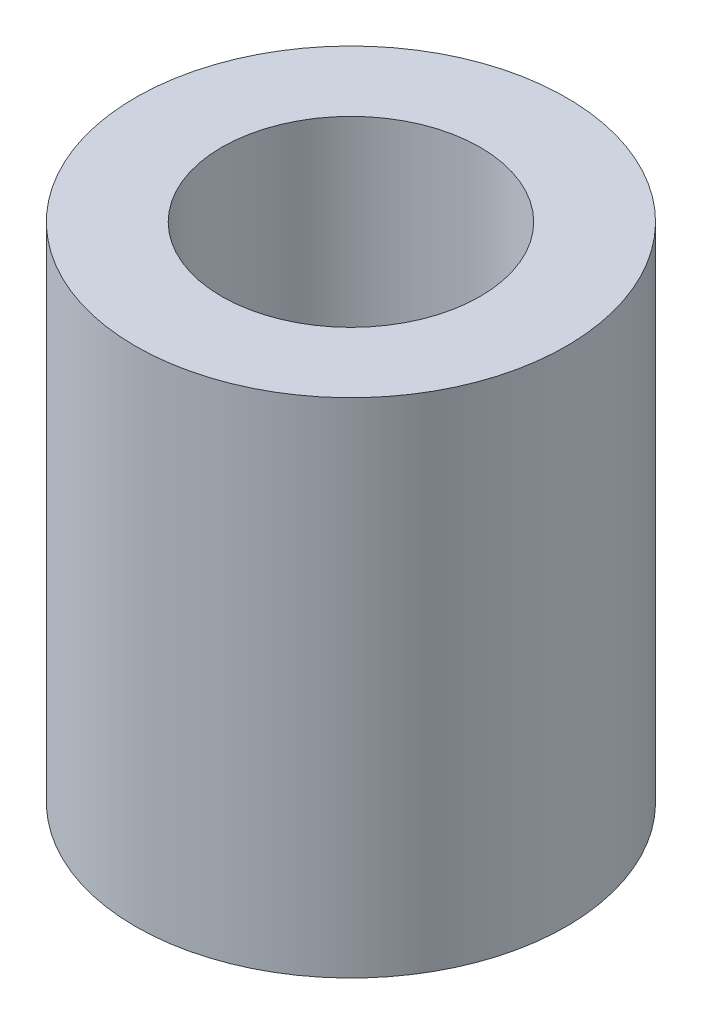
ISO-10303-21;
HEADER;
FILE_DESCRIPTION(('STEP AP214'),'2;1');
FILE_NAME('part.step','',(''),(''),'','','');
FILE_SCHEMA(('AUTOMOTIVE_DESIGN { 1 0 10303 214 1 1 1 1 }'));
ENDSEC;
DATA;
#1=APPLICATION_CONTEXT('core data for automotive mechanical design processes');
#2=APPLICATION_PROTOCOL_DEFINITION('international standard','automotive_design',2000,#1);
#3=PRODUCT_CONTEXT('',#1,'mechanical');
#4=PRODUCT('Part','Part','',(#3));
#5=PRODUCT_RELATED_PRODUCT_CATEGORY('part','',(#4));
#6=PRODUCT_DEFINITION_FORMATION('','',#4);
#7=PRODUCT_DEFINITION_CONTEXT('part definition',#1,'design');
#8=PRODUCT_DEFINITION('design','',#6,#7);
#9=PRODUCT_DEFINITION_SHAPE('','',#8);
#10=(LENGTH_UNIT() NAMED_UNIT(*) SI_UNIT(.MILLI.,.METRE.));
#11=(NAMED_UNIT(*) PLANE_ANGLE_UNIT() SI_UNIT($,.RADIAN.));
#12=(NAMED_UNIT(*) SI_UNIT($,.STERADIAN.) SOLID_ANGLE_UNIT());
#13=UNCERTAINTY_MEASURE_WITH_UNIT(LENGTH_MEASURE(1.E-05),#10,'distance_accuracy_value','');
#14=(GEOMETRIC_REPRESENTATION_CONTEXT(3) GLOBAL_UNCERTAINTY_ASSIGNED_CONTEXT((#13)) GLOBAL_UNIT_ASSIGNED_CONTEXT((#10,
#11,#12)) REPRESENTATION_CONTEXT('',''));
#15=CARTESIAN_POINT('',(0.,0.,0.));
#16=DIRECTION('',(0.,0.,1.));
#17=DIRECTION('',(1.,0.,0.));
#18=AXIS2_PLACEMENT_3D('',#15,#16,#17);
#19=CARTESIAN_POINT('',(0.,7.,0.));
#20=DIRECTION('',(0.,1.,0.));
#21=DIRECTION('',(0.,0.,1.));
#22=AXIS2_PLACEMENT_3D('',#19,#20,#21);
#23=PLANE('',#22);
#24=CARTESIAN_POINT('',(0.,7.,0.));
#25=DIRECTION('',(0.,1.,0.));
#26=DIRECTION('',(0.,0.,1.));
#27=AXIS2_PLACEMENT_3D('',#24,#25,#26);
#28=CIRCLE('',#27,3.);
#29=CARTESIAN_POINT('',(0.,7.,3.));
#30=VERTEX_POINT('',#29);
#31=EDGE_CURVE('E10',#30,#30,#28,.T.);
#32=ORIENTED_EDGE('',*,*,#31,.T.);
#33=EDGE_LOOP('',(#32));
#34=FACE_BOUND('',#33,.T.);
#35=CARTESIAN_POINT('',(0.,7.,0.));
#36=DIRECTION('',(0.,1.,0.));
#37=DIRECTION('',(0.,0.,1.));
#38=AXIS2_PLACEMENT_3D('',#35,#36,#37);
#39=CIRCLE('',#38,1.8);
#40=CARTESIAN_POINT('',(0.,7.,1.8));
#41=VERTEX_POINT('',#40);
#42=EDGE_CURVE('E50',#41,#41,#39,.T.);
#43=ORIENTED_EDGE('',*,*,#42,.F.);
#44=EDGE_LOOP('',(#43));
#45=FACE_BOUND('',#44,.T.);
#46=ADVANCED_FACE('F39',(#34,#45),#23,.T.);
#47=CARTESIAN_POINT('',(0.,0.,0.));
#48=DIRECTION('',(0.,1.,0.));
#49=DIRECTION('',(0.,0.,1.));
#50=AXIS2_PLACEMENT_3D('',#47,#48,#49);
#51=PLANE('',#50);
#52=CARTESIAN_POINT('',(0.,0.,0.));
#53=DIRECTION('',(0.,1.,0.));
#54=DIRECTION('',(0.,0.,1.));
#55=AXIS2_PLACEMENT_3D('',#52,#53,#54);
#56=CIRCLE('',#55,3.);
#57=CARTESIAN_POINT('',(0.,0.,3.));
#58=VERTEX_POINT('',#57);
#59=EDGE_CURVE('E43',#58,#58,#56,.T.);
#60=ORIENTED_EDGE('',*,*,#59,.F.);
#61=EDGE_LOOP('',(#60));
#62=FACE_BOUND('',#61,.T.);
#63=CARTESIAN_POINT('',(0.,0.,0.));
#64=DIRECTION('',(0.,1.,0.));
#65=DIRECTION('',(0.,0.,1.));
#66=AXIS2_PLACEMENT_3D('',#63,#64,#65);
#67=CIRCLE('',#66,1.8);
#68=CARTESIAN_POINT('',(0.,0.,1.8));
#69=VERTEX_POINT('',#68);
#70=EDGE_CURVE('E52',#69,#69,#67,.T.);
#71=ORIENTED_EDGE('',*,*,#70,.T.);
#72=EDGE_LOOP('',(#71));
#73=FACE_BOUND('',#72,.T.);
#74=ADVANCED_FACE('F62',(#62,#73),#51,.F.);
#75=CARTESIAN_POINT('',(0.,7.,0.));
#76=DIRECTION('',(0.,-1.,0.));
#77=DIRECTION('',(0.,0.,-1.));
#78=AXIS2_PLACEMENT_3D('',#75,#76,#77);
#79=CYLINDRICAL_SURFACE('',#78,3.);
#80=ORIENTED_EDGE('',*,*,#31,.F.);
#81=EDGE_LOOP('',(#80));
#82=FACE_BOUND('',#81,.T.);
#83=ORIENTED_EDGE('',*,*,#59,.T.);
#84=EDGE_LOOP('',(#83));
#85=FACE_BOUND('',#84,.T.);
#86=ADVANCED_FACE('F41',(#82,#85),#79,.T.);
#87=CARTESIAN_POINT('',(0.,7.,0.));
#88=DIRECTION('',(0.,-1.,0.));
#89=DIRECTION('',(0.,0.,-1.));
#90=AXIS2_PLACEMENT_3D('',#87,#88,#89);
#91=CYLINDRICAL_SURFACE('',#90,1.8);
#92=ORIENTED_EDGE('',*,*,#42,.T.);
#93=EDGE_LOOP('',(#92));
#94=FACE_BOUND('',#93,.T.);
#95=ORIENTED_EDGE('',*,*,#70,.F.);
#96=EDGE_LOOP('',(#95));
#97=FACE_BOUND('',#96,.T.);
#98=ADVANCED_FACE('F58',(#94,#97),#91,.F.);
#99=CLOSED_SHELL('',(#46,#74,#86,#98));
#100=MANIFOLD_SOLID_BREP('B2',#99);
#101=ADVANCED_BREP_SHAPE_REPRESENTATION('',(#18,#100),#14);
#102=SHAPE_DEFINITION_REPRESENTATION(#9,#101);
ENDSEC;
END-ISO-10303-21;
